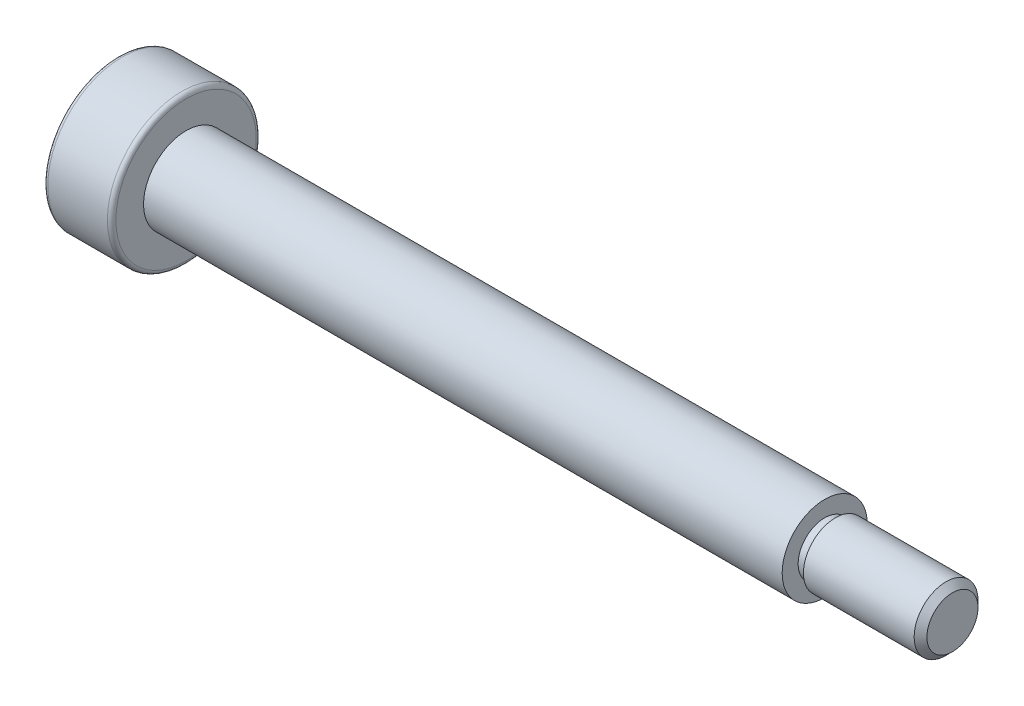
ISO-10303-21;
HEADER;
FILE_DESCRIPTION(('STEP AP214'),'2;1');
FILE_NAME('part.step','',(''),(''),'','','');
FILE_SCHEMA(('AUTOMOTIVE_DESIGN { 1 0 10303 214 1 1 1 1 }'));
ENDSEC;
DATA;
#1=APPLICATION_CONTEXT('core data for automotive mechanical design processes');
#2=APPLICATION_PROTOCOL_DEFINITION('international standard','automotive_design',2000,#1);
#3=PRODUCT_CONTEXT('',#1,'mechanical');
#4=PRODUCT('Part','Part','',(#3));
#5=PRODUCT_RELATED_PRODUCT_CATEGORY('part','',(#4));
#6=PRODUCT_DEFINITION_FORMATION('','',#4);
#7=PRODUCT_DEFINITION_CONTEXT('part definition',#1,'design');
#8=PRODUCT_DEFINITION('design','',#6,#7);
#9=PRODUCT_DEFINITION_SHAPE('','',#8);
#10=(LENGTH_UNIT() NAMED_UNIT(*) SI_UNIT(.MILLI.,.METRE.));
#11=(NAMED_UNIT(*) PLANE_ANGLE_UNIT() SI_UNIT($,.RADIAN.));
#12=(NAMED_UNIT(*) SI_UNIT($,.STERADIAN.) SOLID_ANGLE_UNIT());
#13=UNCERTAINTY_MEASURE_WITH_UNIT(LENGTH_MEASURE(1.E-05),#10,'distance_accuracy_value','');
#14=(GEOMETRIC_REPRESENTATION_CONTEXT(3) GLOBAL_UNCERTAINTY_ASSIGNED_CONTEXT((#13)) GLOBAL_UNIT_ASSIGNED_CONTEXT((#10,
#11,#12)) REPRESENTATION_CONTEXT('',''));
#15=CARTESIAN_POINT('',(0.,0.,0.));
#16=DIRECTION('',(0.,0.,1.));
#17=DIRECTION('',(1.,0.,0.));
#18=AXIS2_PLACEMENT_3D('',#15,#16,#17);
#19=CARTESIAN_POINT('',(-19.6,0.,0.));
#20=DIRECTION('',(1.,0.,0.));
#21=DIRECTION('',(0.,0.,-1.));
#22=AXIS2_PLACEMENT_3D('',#19,#20,#21);
#23=PLANE('',#22);
#24=DIRECTION('',(0.,0.866025403784438,-0.5));
#25=VECTOR('',#24,1.);
#26=CARTESIAN_POINT('',(-19.6,0.,1.73205080756888));
#27=LINE('',#26,#25);
#28=CARTESIAN_POINT('',(-19.6,0.,1.73205080756888));
#29=VERTEX_POINT('',#28);
#30=CARTESIAN_POINT('',(-19.6,1.5,0.866025403784438));
#31=VERTEX_POINT('',#30);
#32=EDGE_CURVE('E127',#29,#31,#27,.T.);
#33=ORIENTED_EDGE('',*,*,#32,.F.);
#34=DIRECTION('',(0.,0.866025403784439,0.5));
#35=VECTOR('',#34,1.);
#36=CARTESIAN_POINT('',(-19.6,-1.5,0.866025403784438));
#37=LINE('',#36,#35);
#38=CARTESIAN_POINT('',(-19.6,-1.5,0.866025403784438));
#39=VERTEX_POINT('',#38);
#40=EDGE_CURVE('E53',#39,#29,#37,.T.);
#41=ORIENTED_EDGE('',*,*,#40,.F.);
#42=DIRECTION('',(0.,0.,1.));
#43=VECTOR('',#42,1.);
#44=CARTESIAN_POINT('',(-19.6,-1.5,-0.866025403784438));
#45=LINE('',#44,#43);
#46=CARTESIAN_POINT('',(-19.6,-1.5,-0.866025403784438));
#47=VERTEX_POINT('',#46);
#48=EDGE_CURVE('E136',#47,#39,#45,.T.);
#49=ORIENTED_EDGE('',*,*,#48,.F.);
#50=DIRECTION('',(0.,-0.866025403784438,0.5));
#51=VECTOR('',#50,1.);
#52=CARTESIAN_POINT('',(-19.6,0.,-1.73205080756888));
#53=LINE('',#52,#51);
#54=CARTESIAN_POINT('',(-19.6,0.,-1.73205080756888));
#55=VERTEX_POINT('',#54);
#56=EDGE_CURVE('E134',#55,#47,#53,.T.);
#57=ORIENTED_EDGE('',*,*,#56,.F.);
#58=DIRECTION('',(0.,-0.866025403784439,-0.5));
#59=VECTOR('',#58,1.);
#60=CARTESIAN_POINT('',(-19.6,1.5,-0.866025403784438));
#61=LINE('',#60,#59);
#62=CARTESIAN_POINT('',(-19.6,1.5,-0.866025403784438));
#63=VERTEX_POINT('',#62);
#64=EDGE_CURVE('E101',#63,#55,#61,.T.);
#65=ORIENTED_EDGE('',*,*,#64,.F.);
#66=DIRECTION('',(0.,0.,-1.));
#67=VECTOR('',#66,1.);
#68=CARTESIAN_POINT('',(-19.6,1.5,0.866025403784438));
#69=LINE('',#68,#67);
#70=EDGE_CURVE('E130',#31,#63,#69,.T.);
#71=ORIENTED_EDGE('',*,*,#70,.F.);
#72=EDGE_LOOP('',(#33,#41,#49,#57,#65,#71));
#73=FACE_BOUND('',#72,.T.);
#74=CARTESIAN_POINT('',(-19.6,0.,0.));
#75=DIRECTION('',(1.,0.,0.));
#76=DIRECTION('',(0.,0.,-1.));
#77=AXIS2_PLACEMENT_3D('',#74,#75,#76);
#78=CIRCLE('',#77,3.3);
#79=CARTESIAN_POINT('',(-19.6,0.,-3.3));
#80=VERTEX_POINT('',#79);
#81=EDGE_CURVE('E169',#80,#80,#78,.F.);
#82=ORIENTED_EDGE('',*,*,#81,.T.);
#83=EDGE_LOOP('',(#82));
#84=FACE_BOUND('',#83,.T.);
#85=ADVANCED_FACE('F37',(#73,#84),#23,.F.);
#86=CARTESIAN_POINT('',(-19.6,0.,0.));
#87=DIRECTION('',(-1.,0.,0.));
#88=DIRECTION('',(0.,0.,1.));
#89=AXIS2_PLACEMENT_3D('',#86,#87,#88);
#90=CYLINDRICAL_SURFACE('',#89,3.5);
#91=CARTESIAN_POINT('',(-16.6,0.,0.));
#92=DIRECTION('',(-1.,0.,0.));
#93=DIRECTION('',(0.,0.,1.));
#94=AXIS2_PLACEMENT_3D('',#91,#92,#93);
#95=CIRCLE('',#94,3.5);
#96=CARTESIAN_POINT('',(-16.6,0.,3.5));
#97=VERTEX_POINT('',#96);
#98=EDGE_CURVE('E163',#97,#97,#95,.T.);
#99=ORIENTED_EDGE('',*,*,#98,.T.);
#100=EDGE_LOOP('',(#99));
#101=FACE_BOUND('',#100,.T.);
#102=CARTESIAN_POINT('',(-19.4,0.,0.));
#103=DIRECTION('',(1.,0.,0.));
#104=DIRECTION('',(0.,0.,-1.));
#105=AXIS2_PLACEMENT_3D('',#102,#103,#104);
#106=CIRCLE('',#105,3.5);
#107=CARTESIAN_POINT('',(-19.4,0.,-3.5));
#108=VERTEX_POINT('',#107);
#109=EDGE_CURVE('E160',#108,#108,#106,.T.);
#110=ORIENTED_EDGE('',*,*,#109,.T.);
#111=EDGE_LOOP('',(#110));
#112=FACE_BOUND('',#111,.T.);
#113=ADVANCED_FACE('F191',(#101,#112),#90,.T.);
#114=CARTESIAN_POINT('',(-16.4,3.5,0.));
#115=DIRECTION('',(-1.,0.,0.));
#116=DIRECTION('',(0.,0.,1.));
#117=AXIS2_PLACEMENT_3D('',#114,#115,#116);
#118=PLANE('',#117);
#119=CARTESIAN_POINT('',(-16.4,0.,0.));
#120=DIRECTION('',(-1.,0.,0.));
#121=DIRECTION('',(0.,0.,1.));
#122=AXIS2_PLACEMENT_3D('',#119,#120,#121);
#123=CIRCLE('',#122,3.3);
#124=CARTESIAN_POINT('',(-16.4,0.,3.3));
#125=VERTEX_POINT('',#124);
#126=EDGE_CURVE('E166',#125,#125,#123,.F.);
#127=ORIENTED_EDGE('',*,*,#126,.T.);
#128=EDGE_LOOP('',(#127));
#129=FACE_BOUND('',#128,.T.);
#130=CARTESIAN_POINT('',(-16.4,0.,0.));
#131=DIRECTION('',(-1.,0.,0.));
#132=DIRECTION('',(0.,0.,1.));
#133=AXIS2_PLACEMENT_3D('',#130,#131,#132);
#134=CIRCLE('',#133,2.);
#135=CARTESIAN_POINT('',(-16.4,0.,2.));
#136=VERTEX_POINT('',#135);
#137=EDGE_CURVE('E157',#136,#136,#134,.T.);
#138=ORIENTED_EDGE('',*,*,#137,.T.);
#139=EDGE_LOOP('',(#138));
#140=FACE_BOUND('',#139,.T.);
#141=ADVANCED_FACE('F197',(#129,#140),#118,.F.);
#142=CARTESIAN_POINT('',(-19.6,0.,0.));
#143=DIRECTION('',(-1.,0.,0.));
#144=DIRECTION('',(0.,0.,1.));
#145=AXIS2_PLACEMENT_3D('',#142,#143,#144);
#146=CYLINDRICAL_SURFACE('',#145,2.);
#147=ORIENTED_EDGE('',*,*,#137,.F.);
#148=EDGE_LOOP('',(#147));
#149=FACE_BOUND('',#148,.T.);
#150=CARTESIAN_POINT('',(13.6,0.,0.));
#151=DIRECTION('',(-1.,0.,0.));
#152=DIRECTION('',(0.,0.,1.));
#153=AXIS2_PLACEMENT_3D('',#150,#151,#152);
#154=CIRCLE('',#153,2.);
#155=CARTESIAN_POINT('',(13.6,0.,2.));
#156=VERTEX_POINT('',#155);
#157=EDGE_CURVE('E154',#156,#156,#154,.T.);
#158=ORIENTED_EDGE('',*,*,#157,.T.);
#159=EDGE_LOOP('',(#158));
#160=FACE_BOUND('',#159,.T.);
#161=ADVANCED_FACE('F231',(#149,#160),#146,.T.);
#162=CARTESIAN_POINT('',(13.6,2.,0.));
#163=DIRECTION('',(-1.,0.,0.));
#164=DIRECTION('',(0.,0.,1.));
#165=AXIS2_PLACEMENT_3D('',#162,#163,#164);
#166=PLANE('',#165);
#167=ORIENTED_EDGE('',*,*,#157,.F.);
#168=EDGE_LOOP('',(#167));
#169=FACE_BOUND('',#168,.T.);
#170=CARTESIAN_POINT('',(13.6,0.,0.));
#171=DIRECTION('',(-1.,0.,0.));
#172=DIRECTION('',(0.,0.,1.));
#173=AXIS2_PLACEMENT_3D('',#170,#171,#172);
#174=CIRCLE('',#173,1.25);
#175=CARTESIAN_POINT('',(13.6,0.,1.25));
#176=VERTEX_POINT('',#175);
#177=EDGE_CURVE('E151',#176,#176,#174,.T.);
#178=ORIENTED_EDGE('',*,*,#177,.T.);
#179=EDGE_LOOP('',(#178));
#180=FACE_BOUND('',#179,.T.);
#181=ADVANCED_FACE('F207',(#169,#180),#166,.F.);
#182=CARTESIAN_POINT('',(-16.6,0.,0.));
#183=DIRECTION('',(-1.,0.,0.));
#184=DIRECTION('',(0.,0.,1.));
#185=AXIS2_PLACEMENT_3D('',#182,#183,#184);
#186=TOROIDAL_SURFACE('',#185,3.3,0.2);
#187=ORIENTED_EDGE('',*,*,#126,.F.);
#188=EDGE_LOOP('',(#187));
#189=FACE_BOUND('',#188,.T.);
#190=ORIENTED_EDGE('',*,*,#98,.F.);
#191=EDGE_LOOP('',(#190));
#192=FACE_BOUND('',#191,.T.);
#193=ADVANCED_FACE('F204',(#189,#192),#186,.T.);
#194=CARTESIAN_POINT('',(-19.4,0.,0.));
#195=DIRECTION('',(1.,0.,0.));
#196=DIRECTION('',(0.,0.,-1.));
#197=AXIS2_PLACEMENT_3D('',#194,#195,#196);
#198=TOROIDAL_SURFACE('',#197,3.3,0.2);
#199=ORIENTED_EDGE('',*,*,#109,.F.);
#200=EDGE_LOOP('',(#199));
#201=FACE_BOUND('',#200,.T.);
#202=ORIENTED_EDGE('',*,*,#81,.F.);
#203=EDGE_LOOP('',(#202));
#204=FACE_BOUND('',#203,.T.);
#205=ADVANCED_FACE('F206',(#201,#204),#198,.T.);
#206=CARTESIAN_POINT('',(13.6,0.,0.));
#207=DIRECTION('',(-1.,0.,0.));
#208=DIRECTION('',(0.,0.,1.));
#209=AXIS2_PLACEMENT_3D('',#206,#207,#208);
#210=CYLINDRICAL_SURFACE('',#209,1.25);
#211=CARTESIAN_POINT('',(14.1,0.,0.));
#212=DIRECTION('',(-1.,0.,0.));
#213=DIRECTION('',(0.,0.,1.));
#214=AXIS2_PLACEMENT_3D('',#211,#212,#213);
#215=CIRCLE('',#214,1.25);
#216=CARTESIAN_POINT('',(14.1,0.,1.25));
#217=VERTEX_POINT('',#216);
#218=EDGE_CURVE('E148',#217,#217,#215,.T.);
#219=ORIENTED_EDGE('',*,*,#218,.T.);
#220=EDGE_LOOP('',(#219));
#221=FACE_BOUND('',#220,.T.);
#222=ORIENTED_EDGE('',*,*,#177,.F.);
#223=EDGE_LOOP('',(#222));
#224=FACE_BOUND('',#223,.T.);
#225=ADVANCED_FACE('F210',(#221,#224),#210,.T.);
#226=CARTESIAN_POINT('',(14.1,1.5,0.));
#227=DIRECTION('',(-1.,0.,0.));
#228=DIRECTION('',(0.,0.,1.));
#229=AXIS2_PLACEMENT_3D('',#226,#227,#228);
#230=PLANE('',#229);
#231=CARTESIAN_POINT('',(14.1,0.,0.));
#232=DIRECTION('',(-1.,0.,0.));
#233=DIRECTION('',(0.,0.,1.));
#234=AXIS2_PLACEMENT_3D('',#231,#232,#233);
#235=CIRCLE('',#234,1.5);
#236=CARTESIAN_POINT('',(14.1,0.,1.5));
#237=VERTEX_POINT('',#236);
#238=EDGE_CURVE('E140',#237,#237,#235,.T.);
#239=ORIENTED_EDGE('',*,*,#238,.T.);
#240=EDGE_LOOP('',(#239));
#241=FACE_BOUND('',#240,.T.);
#242=ORIENTED_EDGE('',*,*,#218,.F.);
#243=EDGE_LOOP('',(#242));
#244=FACE_BOUND('',#243,.T.);
#245=ADVANCED_FACE('F186',(#241,#244),#230,.T.);
#246=CARTESIAN_POINT('',(19.6,1.5,0.));
#247=DIRECTION('',(-1.,0.,0.));
#248=DIRECTION('',(0.,0.,1.));
#249=AXIS2_PLACEMENT_3D('',#246,#247,#248);
#250=PLANE('',#249);
#251=CARTESIAN_POINT('',(19.6,0.,0.));
#252=DIRECTION('',(-1.,0.,0.));
#253=DIRECTION('',(0.,0.,1.));
#254=AXIS2_PLACEMENT_3D('',#251,#252,#253);
#255=CIRCLE('',#254,1.19999999999999);
#256=CARTESIAN_POINT('',(19.6,0.,1.19999999999999));
#257=VERTEX_POINT('',#256);
#258=EDGE_CURVE('E11',#257,#257,#255,.F.);
#259=ORIENTED_EDGE('',*,*,#258,.T.);
#260=EDGE_LOOP('',(#259));
#261=FACE_BOUND('',#260,.T.);
#262=ADVANCED_FACE('F178',(#261),#250,.F.);
#263=CARTESIAN_POINT('',(19.3,0.,0.));
#264=DIRECTION('',(-1.,0.,0.));
#265=DIRECTION('',(0.,0.,1.));
#266=AXIS2_PLACEMENT_3D('',#263,#264,#265);
#267=CONICAL_SURFACE('',#266,1.5,0.785398163397447);
#268=ORIENTED_EDGE('',*,*,#258,.F.);
#269=EDGE_LOOP('',(#268));
#270=FACE_BOUND('',#269,.T.);
#271=CARTESIAN_POINT('',(19.3,0.,0.));
#272=DIRECTION('',(-1.,0.,0.));
#273=DIRECTION('',(0.,0.,1.));
#274=AXIS2_PLACEMENT_3D('',#271,#272,#273);
#275=CIRCLE('',#274,1.5);
#276=CARTESIAN_POINT('',(19.3,0.,1.5));
#277=VERTEX_POINT('',#276);
#278=EDGE_CURVE('E46',#277,#277,#275,.T.);
#279=ORIENTED_EDGE('',*,*,#278,.F.);
#280=EDGE_LOOP('',(#279));
#281=FACE_BOUND('',#280,.T.);
#282=ADVANCED_FACE('F40',(#270,#281),#267,.T.);
#283=CARTESIAN_POINT('',(-19.6,0.,0.));
#284=DIRECTION('',(-1.,0.,0.));
#285=DIRECTION('',(0.,0.,1.));
#286=AXIS2_PLACEMENT_3D('',#283,#284,#285);
#287=CYLINDRICAL_SURFACE('',#286,1.5);
#288=ORIENTED_EDGE('',*,*,#278,.T.);
#289=EDGE_LOOP('',(#288));
#290=FACE_BOUND('',#289,.T.);
#291=ORIENTED_EDGE('',*,*,#238,.F.);
#292=EDGE_LOOP('',(#291));
#293=FACE_BOUND('',#292,.T.);
#294=ADVANCED_FACE('F174',(#290,#293),#287,.T.);
#295=CARTESIAN_POINT('',(-17.6,-1.5,0.866025403784438));
#296=DIRECTION('',(0.,-0.5,0.866025403784439));
#297=DIRECTION('',(0.,-0.866025403784439,-0.5));
#298=AXIS2_PLACEMENT_3D('',#295,#296,#297);
#299=PLANE('',#298);
#300=ORIENTED_EDGE('',*,*,#40,.T.);
#301=DIRECTION('',(-1.,0.,0.));
#302=VECTOR('',#301,1.);
#303=CARTESIAN_POINT('',(-17.6,0.,1.73205080756888));
#304=LINE('',#303,#302);
#305=CARTESIAN_POINT('',(-17.6,0.,1.73205080756888));
#306=VERTEX_POINT('',#305);
#307=EDGE_CURVE('E83',#306,#29,#304,.T.);
#308=ORIENTED_EDGE('',*,*,#307,.F.);
#309=DIRECTION('',(0.,0.866025403784439,0.5));
#310=VECTOR('',#309,1.);
#311=CARTESIAN_POINT('',(-17.6,-1.5,0.866025403784438));
#312=LINE('',#311,#310);
#313=CARTESIAN_POINT('',(-17.6,-1.5,0.866025403784438));
#314=VERTEX_POINT('',#313);
#315=EDGE_CURVE('E138',#314,#306,#312,.T.);
#316=ORIENTED_EDGE('',*,*,#315,.F.);
#317=DIRECTION('',(-1.,0.,0.));
#318=VECTOR('',#317,1.);
#319=CARTESIAN_POINT('',(-17.6,-1.5,0.866025403784438));
#320=LINE('',#319,#318);
#321=EDGE_CURVE('E61',#314,#39,#320,.T.);
#322=ORIENTED_EDGE('',*,*,#321,.T.);
#323=EDGE_LOOP('',(#300,#308,#316,#322));
#324=FACE_BOUND('',#323,.T.);
#325=ADVANCED_FACE('F184',(#324),#299,.F.);
#326=CARTESIAN_POINT('',(-17.6,-1.5,-0.866025403784438));
#327=DIRECTION('',(0.,-1.,0.));
#328=DIRECTION('',(0.,0.,-1.));
#329=AXIS2_PLACEMENT_3D('',#326,#327,#328);
#330=PLANE('',#329);
#331=ORIENTED_EDGE('',*,*,#48,.T.);
#332=ORIENTED_EDGE('',*,*,#321,.F.);
#333=DIRECTION('',(0.,0.,1.));
#334=VECTOR('',#333,1.);
#335=CARTESIAN_POINT('',(-17.6,-1.5,-0.866025403784438));
#336=LINE('',#335,#334);
#337=CARTESIAN_POINT('',(-17.6,-1.5,-0.866025403784438));
#338=VERTEX_POINT('',#337);
#339=EDGE_CURVE('E113',#338,#314,#336,.T.);
#340=ORIENTED_EDGE('',*,*,#339,.F.);
#341=DIRECTION('',(-1.,0.,0.));
#342=VECTOR('',#341,1.);
#343=CARTESIAN_POINT('',(-17.6,-1.5,-0.866025403784438));
#344=LINE('',#343,#342);
#345=EDGE_CURVE('E105',#338,#47,#344,.T.);
#346=ORIENTED_EDGE('',*,*,#345,.T.);
#347=EDGE_LOOP('',(#331,#332,#340,#346));
#348=FACE_BOUND('',#347,.T.);
#349=ADVANCED_FACE('F305',(#348),#330,.F.);
#350=CARTESIAN_POINT('',(-17.6,0.,-1.73205080756888));
#351=DIRECTION('',(0.,-0.5,-0.866025403784438));
#352=DIRECTION('',(0.,0.866025403784439,-0.5));
#353=AXIS2_PLACEMENT_3D('',#350,#351,#352);
#354=PLANE('',#353);
#355=ORIENTED_EDGE('',*,*,#56,.T.);
#356=ORIENTED_EDGE('',*,*,#345,.F.);
#357=DIRECTION('',(0.,-0.866025403784438,0.5));
#358=VECTOR('',#357,1.);
#359=CARTESIAN_POINT('',(-17.6,0.,-1.73205080756888));
#360=LINE('',#359,#358);
#361=CARTESIAN_POINT('',(-17.6,0.,-1.73205080756888));
#362=VERTEX_POINT('',#361);
#363=EDGE_CURVE('E109',#362,#338,#360,.T.);
#364=ORIENTED_EDGE('',*,*,#363,.F.);
#365=DIRECTION('',(-1.,0.,0.));
#366=VECTOR('',#365,1.);
#367=CARTESIAN_POINT('',(-17.6,0.,-1.73205080756888));
#368=LINE('',#367,#366);
#369=EDGE_CURVE('E94',#362,#55,#368,.T.);
#370=ORIENTED_EDGE('',*,*,#369,.T.);
#371=EDGE_LOOP('',(#355,#356,#364,#370));
#372=FACE_BOUND('',#371,.T.);
#373=ADVANCED_FACE('F110',(#372),#354,.F.);
#374=CARTESIAN_POINT('',(-17.6,1.5,-0.866025403784438));
#375=DIRECTION('',(0.,0.5,-0.866025403784439));
#376=DIRECTION('',(0.,0.866025403784439,0.5));
#377=AXIS2_PLACEMENT_3D('',#374,#375,#376);
#378=PLANE('',#377);
#379=ORIENTED_EDGE('',*,*,#64,.T.);
#380=ORIENTED_EDGE('',*,*,#369,.F.);
#381=DIRECTION('',(0.,-0.866025403784439,-0.5));
#382=VECTOR('',#381,1.);
#383=CARTESIAN_POINT('',(-17.6,1.5,-0.866025403784438));
#384=LINE('',#383,#382);
#385=CARTESIAN_POINT('',(-17.6,1.5,-0.866025403784438));
#386=VERTEX_POINT('',#385);
#387=EDGE_CURVE('E98',#386,#362,#384,.T.);
#388=ORIENTED_EDGE('',*,*,#387,.F.);
#389=DIRECTION('',(-1.,0.,0.));
#390=VECTOR('',#389,1.);
#391=CARTESIAN_POINT('',(-17.6,1.5,-0.866025403784438));
#392=LINE('',#391,#390);
#393=EDGE_CURVE('E106',#386,#63,#392,.T.);
#394=ORIENTED_EDGE('',*,*,#393,.T.);
#395=EDGE_LOOP('',(#379,#380,#388,#394));
#396=FACE_BOUND('',#395,.T.);
#397=ADVANCED_FACE('F96',(#396),#378,.F.);
#398=CARTESIAN_POINT('',(-17.6,1.5,0.866025403784438));
#399=DIRECTION('',(0.,1.,0.));
#400=DIRECTION('',(0.,0.,1.));
#401=AXIS2_PLACEMENT_3D('',#398,#399,#400);
#402=PLANE('',#401);
#403=ORIENTED_EDGE('',*,*,#70,.T.);
#404=ORIENTED_EDGE('',*,*,#393,.F.);
#405=DIRECTION('',(0.,0.,-1.));
#406=VECTOR('',#405,1.);
#407=CARTESIAN_POINT('',(-17.6,1.5,0.866025403784438));
#408=LINE('',#407,#406);
#409=CARTESIAN_POINT('',(-17.6,1.5,0.866025403784438));
#410=VERTEX_POINT('',#409);
#411=EDGE_CURVE('E119',#410,#386,#408,.T.);
#412=ORIENTED_EDGE('',*,*,#411,.F.);
#413=DIRECTION('',(-1.,0.,0.));
#414=VECTOR('',#413,1.);
#415=CARTESIAN_POINT('',(-17.6,1.5,0.866025403784438));
#416=LINE('',#415,#414);
#417=EDGE_CURVE('E143',#410,#31,#416,.T.);
#418=ORIENTED_EDGE('',*,*,#417,.T.);
#419=EDGE_LOOP('',(#403,#404,#412,#418));
#420=FACE_BOUND('',#419,.T.);
#421=ADVANCED_FACE('F326',(#420),#402,.F.);
#422=CARTESIAN_POINT('',(-17.6,0.,1.73205080756888));
#423=DIRECTION('',(0.,0.5,0.866025403784438));
#424=DIRECTION('',(0.,-0.866025403784439,0.5));
#425=AXIS2_PLACEMENT_3D('',#422,#423,#424);
#426=PLANE('',#425);
#427=ORIENTED_EDGE('',*,*,#32,.T.);
#428=ORIENTED_EDGE('',*,*,#417,.F.);
#429=DIRECTION('',(0.,0.866025403784438,-0.5));
#430=VECTOR('',#429,1.);
#431=CARTESIAN_POINT('',(-17.6,0.,1.73205080756888));
#432=LINE('',#431,#430);
#433=EDGE_CURVE('E121',#306,#410,#432,.T.);
#434=ORIENTED_EDGE('',*,*,#433,.F.);
#435=ORIENTED_EDGE('',*,*,#307,.T.);
#436=EDGE_LOOP('',(#427,#428,#434,#435));
#437=FACE_BOUND('',#436,.T.);
#438=ADVANCED_FACE('F334',(#437),#426,.F.);
#439=CARTESIAN_POINT('',(-17.6,0.,0.));
#440=DIRECTION('',(-1.,0.,0.));
#441=DIRECTION('',(0.,0.,1.));
#442=AXIS2_PLACEMENT_3D('',#439,#440,#441);
#443=PLANE('',#442);
#444=ORIENTED_EDGE('',*,*,#315,.T.);
#445=ORIENTED_EDGE('',*,*,#433,.T.);
#446=ORIENTED_EDGE('',*,*,#411,.T.);
#447=ORIENTED_EDGE('',*,*,#387,.T.);
#448=ORIENTED_EDGE('',*,*,#363,.T.);
#449=ORIENTED_EDGE('',*,*,#339,.T.);
#450=EDGE_LOOP('',(#444,#445,#446,#447,#448,#449));
#451=FACE_BOUND('',#450,.T.);
#452=ADVANCED_FACE('F116',(#451),#443,.T.);
#453=CLOSED_SHELL('',(#85,#113,#141,#161,#181,#193,#205,#225,#245,#262,#282,#294,#325,#349,#373,
#397,#421,#438,#452));
#454=MANIFOLD_SOLID_BREP('B2',#453);
#455=ADVANCED_BREP_SHAPE_REPRESENTATION('',(#18,#454),#14);
#456=SHAPE_DEFINITION_REPRESENTATION(#9,#455);
ENDSEC;
END-ISO-10303-21;
